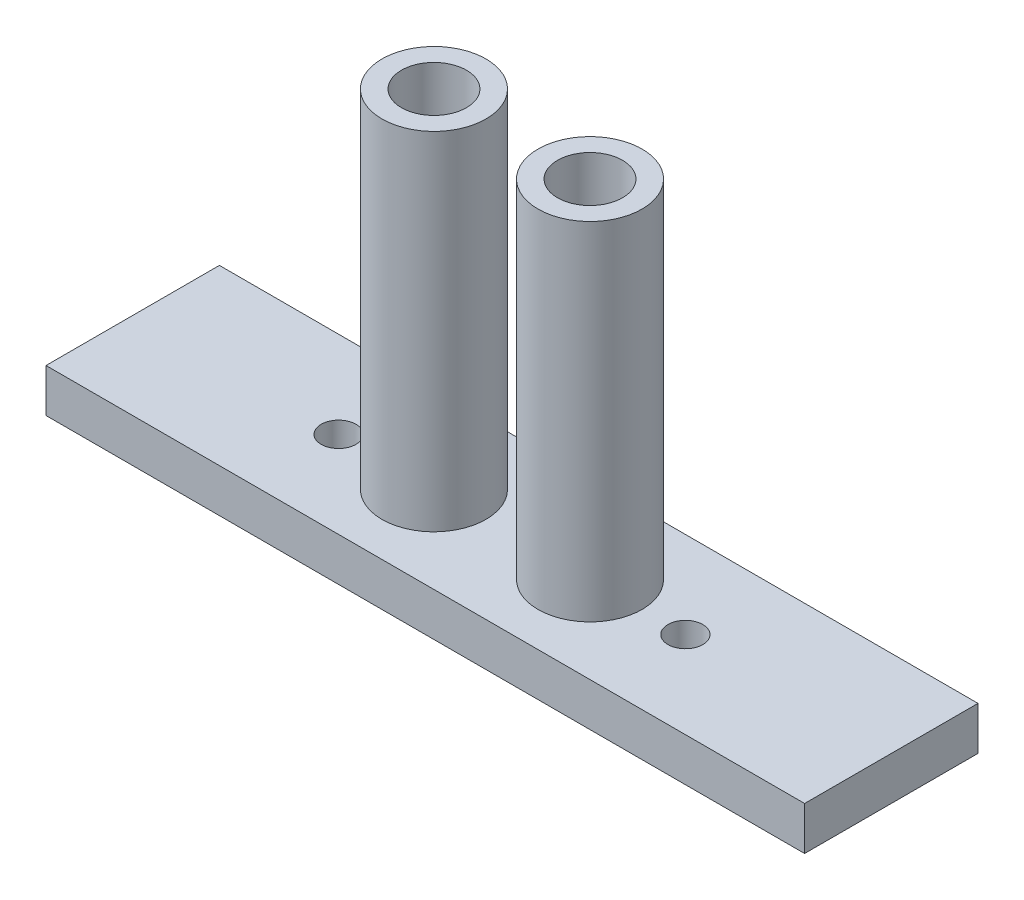
ISO-10303-21;
HEADER;
FILE_DESCRIPTION(('STEP AP214'),'2;1');
FILE_NAME('part.step','',(''),(''),'','','');
FILE_SCHEMA(('AUTOMOTIVE_DESIGN { 1 0 10303 214 1 1 1 1 }'));
ENDSEC;
DATA;
#1=APPLICATION_CONTEXT('core data for automotive mechanical design processes');
#2=APPLICATION_PROTOCOL_DEFINITION('international standard','automotive_design',2000,#1);
#3=PRODUCT_CONTEXT('',#1,'mechanical');
#4=PRODUCT('Part','Part','',(#3));
#5=PRODUCT_RELATED_PRODUCT_CATEGORY('part','',(#4));
#6=PRODUCT_DEFINITION_FORMATION('','',#4);
#7=PRODUCT_DEFINITION_CONTEXT('part definition',#1,'design');
#8=PRODUCT_DEFINITION('design','',#6,#7);
#9=PRODUCT_DEFINITION_SHAPE('','',#8);
#10=(LENGTH_UNIT() NAMED_UNIT(*) SI_UNIT(.MILLI.,.METRE.));
#11=(NAMED_UNIT(*) PLANE_ANGLE_UNIT() SI_UNIT($,.RADIAN.));
#12=(NAMED_UNIT(*) SI_UNIT($,.STERADIAN.) SOLID_ANGLE_UNIT());
#13=UNCERTAINTY_MEASURE_WITH_UNIT(LENGTH_MEASURE(1.E-05),#10,'distance_accuracy_value','');
#14=(GEOMETRIC_REPRESENTATION_CONTEXT(3) GLOBAL_UNCERTAINTY_ASSIGNED_CONTEXT((#13)) GLOBAL_UNIT_ASSIGNED_CONTEXT((#10,
#11,#12)) REPRESENTATION_CONTEXT('',''));
#15=CARTESIAN_POINT('',(0.,0.,0.));
#16=DIRECTION('',(0.,0.,1.));
#17=DIRECTION('',(1.,0.,0.));
#18=AXIS2_PLACEMENT_3D('',#15,#16,#17);
#19=CARTESIAN_POINT('',(0.,6.35,25.4));
#20=DIRECTION('',(0.,0.,1.));
#21=DIRECTION('',(1.,0.,0.));
#22=AXIS2_PLACEMENT_3D('',#19,#20,#21);
#23=PLANE('',#22);
#24=DIRECTION('',(-1.,0.,0.));
#25=VECTOR('',#24,1.);
#26=CARTESIAN_POINT('',(0.,0.,25.4));
#27=LINE('',#26,#25);
#28=CARTESIAN_POINT('',(0.,0.,25.4));
#29=VERTEX_POINT('',#28);
#30=CARTESIAN_POINT('',(-111.125,0.,25.4));
#31=VERTEX_POINT('',#30);
#32=EDGE_CURVE('E125',#29,#31,#27,.T.);
#33=ORIENTED_EDGE('',*,*,#32,.F.);
#34=DIRECTION('',(0.,-1.,0.));
#35=VECTOR('',#34,1.);
#36=CARTESIAN_POINT('',(0.,6.35,25.4));
#37=LINE('',#36,#35);
#38=CARTESIAN_POINT('',(0.,6.35,25.4));
#39=VERTEX_POINT('',#38);
#40=EDGE_CURVE('E68',#39,#29,#37,.T.);
#41=ORIENTED_EDGE('',*,*,#40,.F.);
#42=DIRECTION('',(-1.,0.,0.));
#43=VECTOR('',#42,1.);
#44=CARTESIAN_POINT('',(0.,6.35,25.4));
#45=LINE('',#44,#43);
#46=CARTESIAN_POINT('',(-111.125,6.35,25.4));
#47=VERTEX_POINT('',#46);
#48=EDGE_CURVE('E116',#39,#47,#45,.T.);
#49=ORIENTED_EDGE('',*,*,#48,.T.);
#50=DIRECTION('',(0.,-1.,0.));
#51=VECTOR('',#50,1.);
#52=CARTESIAN_POINT('',(-111.125,6.35,25.4));
#53=LINE('',#52,#51);
#54=EDGE_CURVE('E112',#47,#31,#53,.T.);
#55=ORIENTED_EDGE('',*,*,#54,.T.);
#56=EDGE_LOOP('',(#33,#41,#49,#55));
#57=FACE_BOUND('',#56,.T.);
#58=ADVANCED_FACE('F51',(#57),#23,.T.);
#59=CARTESIAN_POINT('',(0.,6.35,0.));
#60=DIRECTION('',(1.,0.,0.));
#61=DIRECTION('',(0.,0.,-1.));
#62=AXIS2_PLACEMENT_3D('',#59,#60,#61);
#63=PLANE('',#62);
#64=DIRECTION('',(0.,0.,1.));
#65=VECTOR('',#64,1.);
#66=CARTESIAN_POINT('',(0.,0.,0.));
#67=LINE('',#66,#65);
#68=CARTESIAN_POINT('',(0.,0.,0.));
#69=VERTEX_POINT('',#68);
#70=EDGE_CURVE('E119',#69,#29,#67,.T.);
#71=ORIENTED_EDGE('',*,*,#70,.F.);
#72=DIRECTION('',(0.,-1.,0.));
#73=VECTOR('',#72,1.);
#74=CARTESIAN_POINT('',(0.,6.35,0.));
#75=LINE('',#74,#73);
#76=CARTESIAN_POINT('',(0.,6.35,0.));
#77=VERTEX_POINT('',#76);
#78=EDGE_CURVE('E84',#77,#69,#75,.T.);
#79=ORIENTED_EDGE('',*,*,#78,.F.);
#80=DIRECTION('',(0.,0.,1.));
#81=VECTOR('',#80,1.);
#82=CARTESIAN_POINT('',(0.,6.35,0.));
#83=LINE('',#82,#81);
#84=EDGE_CURVE('E101',#77,#39,#83,.T.);
#85=ORIENTED_EDGE('',*,*,#84,.T.);
#86=ORIENTED_EDGE('',*,*,#40,.T.);
#87=EDGE_LOOP('',(#71,#79,#85,#86));
#88=FACE_BOUND('',#87,.T.);
#89=ADVANCED_FACE('F174',(#88),#63,.T.);
#90=CARTESIAN_POINT('',(0.,6.35,0.));
#91=DIRECTION('',(0.,0.,1.));
#92=DIRECTION('',(1.,0.,0.));
#93=AXIS2_PLACEMENT_3D('',#90,#91,#92);
#94=PLANE('',#93);
#95=DIRECTION('',(-1.,0.,0.));
#96=VECTOR('',#95,1.);
#97=CARTESIAN_POINT('',(0.,0.,0.));
#98=LINE('',#97,#96);
#99=CARTESIAN_POINT('',(-111.125,0.,0.));
#100=VERTEX_POINT('',#99);
#101=EDGE_CURVE('E107',#69,#100,#98,.T.);
#102=ORIENTED_EDGE('',*,*,#101,.T.);
#103=DIRECTION('',(0.,-1.,0.));
#104=VECTOR('',#103,1.);
#105=CARTESIAN_POINT('',(-111.125,6.35,0.));
#106=LINE('',#105,#104);
#107=CARTESIAN_POINT('',(-111.125,6.35,0.));
#108=VERTEX_POINT('',#107);
#109=EDGE_CURVE('E105',#108,#100,#106,.T.);
#110=ORIENTED_EDGE('',*,*,#109,.F.);
#111=DIRECTION('',(-1.,0.,0.));
#112=VECTOR('',#111,1.);
#113=CARTESIAN_POINT('',(0.,6.35,0.));
#114=LINE('',#113,#112);
#115=EDGE_CURVE('E98',#77,#108,#114,.T.);
#116=ORIENTED_EDGE('',*,*,#115,.F.);
#117=ORIENTED_EDGE('',*,*,#78,.T.);
#118=EDGE_LOOP('',(#102,#110,#116,#117));
#119=FACE_BOUND('',#118,.T.);
#120=ADVANCED_FACE('F106',(#119),#94,.F.);
#121=CARTESIAN_POINT('',(-111.125,6.35,0.));
#122=DIRECTION('',(1.,0.,0.));
#123=DIRECTION('',(0.,0.,-1.));
#124=AXIS2_PLACEMENT_3D('',#121,#122,#123);
#125=PLANE('',#124);
#126=DIRECTION('',(0.,0.,1.));
#127=VECTOR('',#126,1.);
#128=CARTESIAN_POINT('',(-111.125,0.,0.));
#129=LINE('',#128,#127);
#130=EDGE_CURVE('E129',#100,#31,#129,.T.);
#131=ORIENTED_EDGE('',*,*,#130,.T.);
#132=ORIENTED_EDGE('',*,*,#54,.F.);
#133=DIRECTION('',(0.,0.,1.));
#134=VECTOR('',#133,1.);
#135=CARTESIAN_POINT('',(-111.125,6.35,0.));
#136=LINE('',#135,#134);
#137=EDGE_CURVE('E95',#108,#47,#136,.T.);
#138=ORIENTED_EDGE('',*,*,#137,.F.);
#139=ORIENTED_EDGE('',*,*,#109,.T.);
#140=EDGE_LOOP('',(#131,#132,#138,#139));
#141=FACE_BOUND('',#140,.T.);
#142=ADVANCED_FACE('F114',(#141),#125,.F.);
#143=CARTESIAN_POINT('',(0.,6.35,0.));
#144=DIRECTION('',(0.,1.,0.));
#145=DIRECTION('',(0.,0.,1.));
#146=AXIS2_PLACEMENT_3D('',#143,#144,#145);
#147=PLANE('',#146);
#148=CARTESIAN_POINT('',(-30.1625,6.35,12.7));
#149=DIRECTION('',(0.,1.,0.));
#150=DIRECTION('',(0.,0.,1.));
#151=AXIS2_PLACEMENT_3D('',#148,#149,#150);
#152=CIRCLE('',#151,2.5527);
#153=CARTESIAN_POINT('',(-30.1625,6.35,15.2527));
#154=VERTEX_POINT('',#153);
#155=EDGE_CURVE('E283',#154,#154,#152,.T.);
#156=ORIENTED_EDGE('',*,*,#155,.F.);
#157=EDGE_LOOP('',(#156));
#158=FACE_BOUND('',#157,.T.);
#159=CARTESIAN_POINT('',(-80.9625,6.35,12.7));
#160=DIRECTION('',(0.,1.,0.));
#161=DIRECTION('',(0.,0.,1.));
#162=AXIS2_PLACEMENT_3D('',#159,#160,#161);
#163=CIRCLE('',#162,2.55270000000001);
#164=CARTESIAN_POINT('',(-80.9625,6.35,15.2527));
#165=VERTEX_POINT('',#164);
#166=EDGE_CURVE('E279',#165,#165,#163,.T.);
#167=ORIENTED_EDGE('',*,*,#166,.F.);
#168=EDGE_LOOP('',(#167));
#169=FACE_BOUND('',#168,.T.);
#170=CARTESIAN_POINT('',(-66.9925,6.35,12.7));
#171=DIRECTION('',(0.,1.,0.));
#172=DIRECTION('',(0.,0.,1.));
#173=AXIS2_PLACEMENT_3D('',#170,#171,#172);
#174=CIRCLE('',#173,7.62);
#175=CARTESIAN_POINT('',(-66.9925,6.35,20.32));
#176=VERTEX_POINT('',#175);
#177=EDGE_CURVE('E266',#176,#176,#174,.T.);
#178=ORIENTED_EDGE('',*,*,#177,.F.);
#179=EDGE_LOOP('',(#178));
#180=FACE_BOUND('',#179,.T.);
#181=CARTESIAN_POINT('',(-44.1325,6.35,12.7));
#182=DIRECTION('',(0.,1.,0.));
#183=DIRECTION('',(0.,0.,1.));
#184=AXIS2_PLACEMENT_3D('',#181,#182,#183);
#185=CIRCLE('',#184,7.62);
#186=CARTESIAN_POINT('',(-44.1325,6.35,20.32));
#187=VERTEX_POINT('',#186);
#188=EDGE_CURVE('E252',#187,#187,#185,.T.);
#189=ORIENTED_EDGE('',*,*,#188,.F.);
#190=EDGE_LOOP('',(#189));
#191=FACE_BOUND('',#190,.T.);
#192=ORIENTED_EDGE('',*,*,#48,.F.);
#193=ORIENTED_EDGE('',*,*,#84,.F.);
#194=ORIENTED_EDGE('',*,*,#115,.T.);
#195=ORIENTED_EDGE('',*,*,#137,.T.);
#196=EDGE_LOOP('',(#192,#193,#194,#195));
#197=FACE_BOUND('',#196,.T.);
#198=ADVANCED_FACE('F100',(#158,#169,#180,#191,#197),#147,.T.);
#199=CARTESIAN_POINT('',(0.,0.,0.));
#200=DIRECTION('',(0.,1.,0.));
#201=DIRECTION('',(0.,0.,1.));
#202=AXIS2_PLACEMENT_3D('',#199,#200,#201);
#203=PLANE('',#202);
#204=CARTESIAN_POINT('',(-30.1625,0.,12.7));
#205=DIRECTION('',(0.,1.,0.));
#206=DIRECTION('',(0.,0.,1.));
#207=AXIS2_PLACEMENT_3D('',#204,#205,#206);
#208=CIRCLE('',#207,2.5527);
#209=CARTESIAN_POINT('',(-30.1625,0.,15.2527));
#210=VERTEX_POINT('',#209);
#211=EDGE_CURVE('E271',#210,#210,#208,.T.);
#212=ORIENTED_EDGE('',*,*,#211,.T.);
#213=EDGE_LOOP('',(#212));
#214=FACE_BOUND('',#213,.T.);
#215=CARTESIAN_POINT('',(-80.9625,0.,12.7));
#216=DIRECTION('',(0.,1.,0.));
#217=DIRECTION('',(0.,0.,1.));
#218=AXIS2_PLACEMENT_3D('',#215,#216,#217);
#219=CIRCLE('',#218,2.55270000000001);
#220=CARTESIAN_POINT('',(-80.9625,0.,15.2527));
#221=VERTEX_POINT('',#220);
#222=EDGE_CURVE('E275',#221,#221,#219,.T.);
#223=ORIENTED_EDGE('',*,*,#222,.T.);
#224=EDGE_LOOP('',(#223));
#225=FACE_BOUND('',#224,.T.);
#226=ORIENTED_EDGE('',*,*,#32,.T.);
#227=ORIENTED_EDGE('',*,*,#130,.F.);
#228=ORIENTED_EDGE('',*,*,#101,.F.);
#229=ORIENTED_EDGE('',*,*,#70,.T.);
#230=EDGE_LOOP('',(#226,#227,#228,#229));
#231=FACE_BOUND('',#230,.T.);
#232=ADVANCED_FACE('F167',(#214,#225,#231),#203,.F.);
#233=CARTESIAN_POINT('',(-44.1325,57.15,12.7));
#234=DIRECTION('',(0.,1.,0.));
#235=DIRECTION('',(0.,0.,1.));
#236=AXIS2_PLACEMENT_3D('',#233,#234,#235);
#237=PLANE('',#236);
#238=CARTESIAN_POINT('',(-44.1325,57.15,12.7));
#239=DIRECTION('',(0.,1.,0.));
#240=DIRECTION('',(0.,0.,1.));
#241=AXIS2_PLACEMENT_3D('',#238,#239,#240);
#242=CIRCLE('',#241,7.62);
#243=CARTESIAN_POINT('',(-44.1325,57.15,20.32));
#244=VERTEX_POINT('',#243);
#245=EDGE_CURVE('E130',#244,#244,#242,.T.);
#246=ORIENTED_EDGE('',*,*,#245,.T.);
#247=EDGE_LOOP('',(#246));
#248=FACE_BOUND('',#247,.T.);
#249=CARTESIAN_POINT('',(-44.1325,57.15,12.7));
#250=DIRECTION('',(0.,1.,0.));
#251=DIRECTION('',(0.,0.,1.));
#252=AXIS2_PLACEMENT_3D('',#249,#250,#251);
#253=CIRCLE('',#252,4.7625);
#254=CARTESIAN_POINT('',(-44.1325,57.15,17.4625));
#255=VERTEX_POINT('',#254);
#256=EDGE_CURVE('E255',#255,#255,#253,.T.);
#257=ORIENTED_EDGE('',*,*,#256,.F.);
#258=EDGE_LOOP('',(#257));
#259=FACE_BOUND('',#258,.T.);
#260=ADVANCED_FACE('F181',(#248,#259),#237,.T.);
#261=CARTESIAN_POINT('',(-44.1325,57.15,12.7));
#262=DIRECTION('',(0.,-1.,0.));
#263=DIRECTION('',(0.,0.,-1.));
#264=AXIS2_PLACEMENT_3D('',#261,#262,#263);
#265=CYLINDRICAL_SURFACE('',#264,7.62);
#266=ORIENTED_EDGE('',*,*,#245,.F.);
#267=EDGE_LOOP('',(#266));
#268=FACE_BOUND('',#267,.T.);
#269=ORIENTED_EDGE('',*,*,#188,.T.);
#270=EDGE_LOOP('',(#269));
#271=FACE_BOUND('',#270,.T.);
#272=ADVANCED_FACE('F161',(#268,#271),#265,.T.);
#273=CARTESIAN_POINT('',(-44.1325,57.15,12.7));
#274=DIRECTION('',(0.,-1.,0.));
#275=DIRECTION('',(0.,0.,-1.));
#276=AXIS2_PLACEMENT_3D('',#273,#274,#275);
#277=CYLINDRICAL_SURFACE('',#276,4.7625);
#278=ORIENTED_EDGE('',*,*,#256,.T.);
#279=EDGE_LOOP('',(#278));
#280=FACE_BOUND('',#279,.T.);
#281=CARTESIAN_POINT('',(-44.1325,6.35,12.7));
#282=DIRECTION('',(0.,1.,0.));
#283=DIRECTION('',(0.,0.,1.));
#284=AXIS2_PLACEMENT_3D('',#281,#282,#283);
#285=CIRCLE('',#284,4.7625);
#286=CARTESIAN_POINT('',(-44.1325,6.35,17.4625));
#287=VERTEX_POINT('',#286);
#288=EDGE_CURVE('E60',#287,#287,#285,.F.);
#289=ORIENTED_EDGE('',*,*,#288,.T.);
#290=EDGE_LOOP('',(#289));
#291=FACE_BOUND('',#290,.T.);
#292=ADVANCED_FACE('F147',(#280,#291),#277,.F.);
#293=ORIENTED_EDGE('',*,*,#288,.F.);
#294=EDGE_LOOP('',(#293));
#295=FACE_BOUND('',#294,.T.);
#296=ADVANCED_FACE('F149',(#295),#147,.T.);
#297=CARTESIAN_POINT('',(-66.9925,57.15,12.7));
#298=DIRECTION('',(0.,1.,0.));
#299=DIRECTION('',(0.,0.,1.));
#300=AXIS2_PLACEMENT_3D('',#297,#298,#299);
#301=PLANE('',#300);
#302=CARTESIAN_POINT('',(-66.9925,57.15,12.7));
#303=DIRECTION('',(0.,1.,0.));
#304=DIRECTION('',(0.,0.,1.));
#305=AXIS2_PLACEMENT_3D('',#302,#303,#304);
#306=CIRCLE('',#305,7.62);
#307=CARTESIAN_POINT('',(-66.9925,57.15,20.32));
#308=VERTEX_POINT('',#307);
#309=EDGE_CURVE('E267',#308,#308,#306,.T.);
#310=ORIENTED_EDGE('',*,*,#309,.T.);
#311=EDGE_LOOP('',(#310));
#312=FACE_BOUND('',#311,.T.);
#313=CARTESIAN_POINT('',(-66.9925,57.15,12.7));
#314=DIRECTION('',(0.,1.,0.));
#315=DIRECTION('',(0.,0.,1.));
#316=AXIS2_PLACEMENT_3D('',#313,#314,#315);
#317=CIRCLE('',#316,4.7625);
#318=CARTESIAN_POINT('',(-66.9925,57.15,17.4625));
#319=VERTEX_POINT('',#318);
#320=EDGE_CURVE('E260',#319,#319,#317,.T.);
#321=ORIENTED_EDGE('',*,*,#320,.F.);
#322=EDGE_LOOP('',(#321));
#323=FACE_BOUND('',#322,.T.);
#324=ADVANCED_FACE('F151',(#312,#323),#301,.T.);
#325=CARTESIAN_POINT('',(-66.9925,57.15,12.7));
#326=DIRECTION('',(0.,-1.,0.));
#327=DIRECTION('',(0.,0.,-1.));
#328=AXIS2_PLACEMENT_3D('',#325,#326,#327);
#329=CYLINDRICAL_SURFACE('',#328,7.62);
#330=ORIENTED_EDGE('',*,*,#309,.F.);
#331=EDGE_LOOP('',(#330));
#332=FACE_BOUND('',#331,.T.);
#333=ORIENTED_EDGE('',*,*,#177,.T.);
#334=EDGE_LOOP('',(#333));
#335=FACE_BOUND('',#334,.T.);
#336=ADVANCED_FACE('F158',(#332,#335),#329,.T.);
#337=CARTESIAN_POINT('',(-66.9925,57.15,12.7));
#338=DIRECTION('',(0.,-1.,0.));
#339=DIRECTION('',(0.,0.,-1.));
#340=AXIS2_PLACEMENT_3D('',#337,#338,#339);
#341=CYLINDRICAL_SURFACE('',#340,4.7625);
#342=ORIENTED_EDGE('',*,*,#320,.T.);
#343=EDGE_LOOP('',(#342));
#344=FACE_BOUND('',#343,.T.);
#345=CARTESIAN_POINT('',(-66.9925,6.35,12.7));
#346=DIRECTION('',(0.,1.,0.));
#347=DIRECTION('',(0.,0.,1.));
#348=AXIS2_PLACEMENT_3D('',#345,#346,#347);
#349=CIRCLE('',#348,4.7625);
#350=CARTESIAN_POINT('',(-66.9925,6.35,17.4625));
#351=VERTEX_POINT('',#350);
#352=EDGE_CURVE('E12',#351,#351,#349,.F.);
#353=ORIENTED_EDGE('',*,*,#352,.T.);
#354=EDGE_LOOP('',(#353));
#355=FACE_BOUND('',#354,.T.);
#356=ADVANCED_FACE('F171',(#344,#355),#341,.F.);
#357=ORIENTED_EDGE('',*,*,#352,.F.);
#358=EDGE_LOOP('',(#357));
#359=FACE_BOUND('',#358,.T.);
#360=ADVANCED_FACE('F153',(#359),#147,.T.);
#361=CARTESIAN_POINT('',(-80.9625,0.,12.7));
#362=DIRECTION('',(0.,1.,0.));
#363=DIRECTION('',(0.,0.,1.));
#364=AXIS2_PLACEMENT_3D('',#361,#362,#363);
#365=CYLINDRICAL_SURFACE('',#364,2.55270000000001);
#366=ORIENTED_EDGE('',*,*,#222,.F.);
#367=EDGE_LOOP('',(#366));
#368=FACE_BOUND('',#367,.T.);
#369=ORIENTED_EDGE('',*,*,#166,.T.);
#370=EDGE_LOOP('',(#369));
#371=FACE_BOUND('',#370,.T.);
#372=ADVANCED_FACE('F170',(#368,#371),#365,.F.);
#373=CARTESIAN_POINT('',(-30.1625,0.,12.7));
#374=DIRECTION('',(0.,1.,0.));
#375=DIRECTION('',(0.,0.,1.));
#376=AXIS2_PLACEMENT_3D('',#373,#374,#375);
#377=CYLINDRICAL_SURFACE('',#376,2.5527);
#378=ORIENTED_EDGE('',*,*,#211,.F.);
#379=EDGE_LOOP('',(#378));
#380=FACE_BOUND('',#379,.T.);
#381=ORIENTED_EDGE('',*,*,#155,.T.);
#382=EDGE_LOOP('',(#381));
#383=FACE_BOUND('',#382,.T.);
#384=ADVANCED_FACE('F220',(#380,#383),#377,.F.);
#385=CLOSED_SHELL('',(#58,#89,#120,#142,#198,#232,#260,#272,#292,#296,#324,#336,#356,#360,#372,#384));
#386=MANIFOLD_SOLID_BREP('B2',#385);
#387=ADVANCED_BREP_SHAPE_REPRESENTATION('',(#18,#386),#14);
#388=SHAPE_DEFINITION_REPRESENTATION(#9,#387);
ENDSEC;
END-ISO-10303-21;
